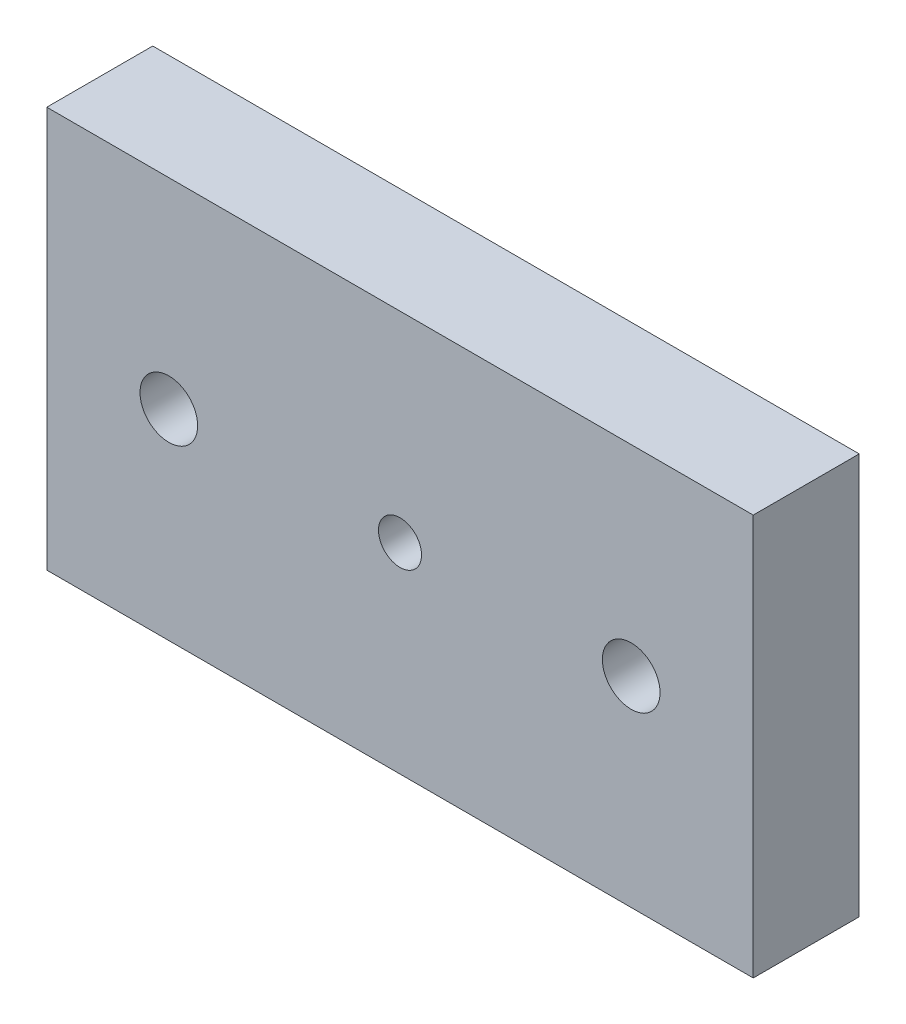
ISO-10303-21;
HEADER;
FILE_DESCRIPTION(('STEP AP214'),'2;1');
FILE_NAME('part.step','',(''),(''),'','','');
FILE_SCHEMA(('AUTOMOTIVE_DESIGN { 1 0 10303 214 1 1 1 1 }'));
ENDSEC;
DATA;
#1=APPLICATION_CONTEXT('core data for automotive mechanical design processes');
#2=APPLICATION_PROTOCOL_DEFINITION('international standard','automotive_design',2000,#1);
#3=PRODUCT_CONTEXT('',#1,'mechanical');
#4=PRODUCT('Part','Part','',(#3));
#5=PRODUCT_RELATED_PRODUCT_CATEGORY('part','',(#4));
#6=PRODUCT_DEFINITION_FORMATION('','',#4);
#7=PRODUCT_DEFINITION_CONTEXT('part definition',#1,'design');
#8=PRODUCT_DEFINITION('design','',#6,#7);
#9=PRODUCT_DEFINITION_SHAPE('','',#8);
#10=(LENGTH_UNIT() NAMED_UNIT(*) SI_UNIT(.MILLI.,.METRE.));
#11=(NAMED_UNIT(*) PLANE_ANGLE_UNIT() SI_UNIT($,.RADIAN.));
#12=(NAMED_UNIT(*) SI_UNIT($,.STERADIAN.) SOLID_ANGLE_UNIT());
#13=UNCERTAINTY_MEASURE_WITH_UNIT(LENGTH_MEASURE(1.E-05),#10,'distance_accuracy_value','');
#14=(GEOMETRIC_REPRESENTATION_CONTEXT(3) GLOBAL_UNCERTAINTY_ASSIGNED_CONTEXT((#13)) GLOBAL_UNIT_ASSIGNED_CONTEXT((#10,
#11,#12)) REPRESENTATION_CONTEXT('',''));
#15=CARTESIAN_POINT('',(0.,0.,0.));
#16=DIRECTION('',(0.,0.,1.));
#17=DIRECTION('',(1.,0.,0.));
#18=AXIS2_PLACEMENT_3D('',#15,#16,#17);
#19=CARTESIAN_POINT('',(20.,11.35,-6.));
#20=DIRECTION('',(1.,0.,0.));
#21=DIRECTION('',(0.,1.,0.));
#22=AXIS2_PLACEMENT_3D('',#19,#20,#21);
#23=PLANE('',#22);
#24=DIRECTION('',(0.,1.,0.));
#25=VECTOR('',#24,1.);
#26=CARTESIAN_POINT('',(20.,11.35,0.));
#27=LINE('',#26,#25);
#28=CARTESIAN_POINT('',(20.,-11.35,0.));
#29=VERTEX_POINT('',#28);
#30=CARTESIAN_POINT('',(20.,11.35,0.));
#31=VERTEX_POINT('',#30);
#32=EDGE_CURVE('E97',#29,#31,#27,.T.);
#33=ORIENTED_EDGE('',*,*,#32,.F.);
#34=DIRECTION('',(0.,0.,1.));
#35=VECTOR('',#34,1.);
#36=CARTESIAN_POINT('',(20.,-11.35,-6.));
#37=LINE('',#36,#35);
#38=CARTESIAN_POINT('',(20.,-11.35,-6.));
#39=VERTEX_POINT('',#38);
#40=EDGE_CURVE('E11',#39,#29,#37,.T.);
#41=ORIENTED_EDGE('',*,*,#40,.F.);
#42=DIRECTION('',(0.,1.,0.));
#43=VECTOR('',#42,1.);
#44=CARTESIAN_POINT('',(20.,11.35,-6.));
#45=LINE('',#44,#43);
#46=CARTESIAN_POINT('',(20.,11.35,-6.));
#47=VERTEX_POINT('',#46);
#48=EDGE_CURVE('E90',#39,#47,#45,.T.);
#49=ORIENTED_EDGE('',*,*,#48,.T.);
#50=DIRECTION('',(0.,0.,1.));
#51=VECTOR('',#50,1.);
#52=CARTESIAN_POINT('',(20.,11.35,-6.));
#53=LINE('',#52,#51);
#54=EDGE_CURVE('E35',#47,#31,#53,.T.);
#55=ORIENTED_EDGE('',*,*,#54,.T.);
#56=EDGE_LOOP('',(#33,#41,#49,#55));
#57=FACE_BOUND('',#56,.T.);
#58=ADVANCED_FACE('F32',(#57),#23,.T.);
#59=CARTESIAN_POINT('',(-20.,-11.35,-6.));
#60=DIRECTION('',(0.,-1.,0.));
#61=DIRECTION('',(0.,0.,-1.));
#62=AXIS2_PLACEMENT_3D('',#59,#60,#61);
#63=PLANE('',#62);
#64=DIRECTION('',(1.,0.,0.));
#65=VECTOR('',#64,1.);
#66=CARTESIAN_POINT('',(-20.,-11.35,0.));
#67=LINE('',#66,#65);
#68=CARTESIAN_POINT('',(-20.,-11.35,0.));
#69=VERTEX_POINT('',#68);
#70=EDGE_CURVE('E92',#69,#29,#67,.T.);
#71=ORIENTED_EDGE('',*,*,#70,.F.);
#72=DIRECTION('',(0.,0.,1.));
#73=VECTOR('',#72,1.);
#74=CARTESIAN_POINT('',(-20.,-11.35,-6.));
#75=LINE('',#74,#73);
#76=CARTESIAN_POINT('',(-20.,-11.35,-6.));
#77=VERTEX_POINT('',#76);
#78=EDGE_CURVE('E41',#77,#69,#75,.T.);
#79=ORIENTED_EDGE('',*,*,#78,.F.);
#80=DIRECTION('',(1.,0.,0.));
#81=VECTOR('',#80,1.);
#82=CARTESIAN_POINT('',(-20.,-11.35,-6.));
#83=LINE('',#82,#81);
#84=EDGE_CURVE('E87',#77,#39,#83,.T.);
#85=ORIENTED_EDGE('',*,*,#84,.T.);
#86=ORIENTED_EDGE('',*,*,#40,.T.);
#87=EDGE_LOOP('',(#71,#79,#85,#86));
#88=FACE_BOUND('',#87,.T.);
#89=ADVANCED_FACE('F108',(#88),#63,.T.);
#90=CARTESIAN_POINT('',(-20.,11.35,-6.));
#91=DIRECTION('',(-1.,0.,0.));
#92=DIRECTION('',(0.,-1.,0.));
#93=AXIS2_PLACEMENT_3D('',#90,#91,#92);
#94=PLANE('',#93);
#95=DIRECTION('',(0.,-1.,0.));
#96=VECTOR('',#95,1.);
#97=CARTESIAN_POINT('',(-20.,11.35,0.));
#98=LINE('',#97,#96);
#99=CARTESIAN_POINT('',(-20.,11.35,0.));
#100=VERTEX_POINT('',#99);
#101=EDGE_CURVE('E82',#100,#69,#98,.T.);
#102=ORIENTED_EDGE('',*,*,#101,.F.);
#103=DIRECTION('',(0.,0.,1.));
#104=VECTOR('',#103,1.);
#105=CARTESIAN_POINT('',(-20.,11.35,-6.));
#106=LINE('',#105,#104);
#107=CARTESIAN_POINT('',(-20.,11.35,-6.));
#108=VERTEX_POINT('',#107);
#109=EDGE_CURVE('E77',#108,#100,#106,.T.);
#110=ORIENTED_EDGE('',*,*,#109,.F.);
#111=DIRECTION('',(0.,-1.,0.));
#112=VECTOR('',#111,1.);
#113=CARTESIAN_POINT('',(-20.,11.35,-6.));
#114=LINE('',#113,#112);
#115=EDGE_CURVE('E80',#108,#77,#114,.T.);
#116=ORIENTED_EDGE('',*,*,#115,.T.);
#117=ORIENTED_EDGE('',*,*,#78,.T.);
#118=EDGE_LOOP('',(#102,#110,#116,#117));
#119=FACE_BOUND('',#118,.T.);
#120=ADVANCED_FACE('F79',(#119),#94,.T.);
#121=CARTESIAN_POINT('',(-20.,11.35,-6.));
#122=DIRECTION('',(0.,1.,0.));
#123=DIRECTION('',(0.,0.,1.));
#124=AXIS2_PLACEMENT_3D('',#121,#122,#123);
#125=PLANE('',#124);
#126=DIRECTION('',(-1.,0.,0.));
#127=VECTOR('',#126,1.);
#128=CARTESIAN_POINT('',(-20.,11.35,0.));
#129=LINE('',#128,#127);
#130=EDGE_CURVE('E100',#31,#100,#129,.T.);
#131=ORIENTED_EDGE('',*,*,#130,.F.);
#132=ORIENTED_EDGE('',*,*,#54,.F.);
#133=DIRECTION('',(-1.,0.,0.));
#134=VECTOR('',#133,1.);
#135=CARTESIAN_POINT('',(-20.,11.35,-6.));
#136=LINE('',#135,#134);
#137=EDGE_CURVE('E86',#47,#108,#136,.T.);
#138=ORIENTED_EDGE('',*,*,#137,.T.);
#139=ORIENTED_EDGE('',*,*,#109,.T.);
#140=EDGE_LOOP('',(#131,#132,#138,#139));
#141=FACE_BOUND('',#140,.T.);
#142=ADVANCED_FACE('F89',(#141),#125,.T.);
#143=CARTESIAN_POINT('',(0.,0.,-6.));
#144=DIRECTION('',(0.,0.,1.));
#145=DIRECTION('',(1.,0.,0.));
#146=AXIS2_PLACEMENT_3D('',#143,#144,#145);
#147=PLANE('',#146);
#148=CARTESIAN_POINT('',(0.,0.,-6.));
#149=DIRECTION('',(0.,0.,1.));
#150=DIRECTION('',(1.,0.,0.));
#151=AXIS2_PLACEMENT_3D('',#148,#149,#150);
#152=CIRCLE('',#151,1.2192);
#153=CARTESIAN_POINT('',(1.2192,0.,-6.));
#154=VERTEX_POINT('',#153);
#155=EDGE_CURVE('E145',#154,#154,#152,.T.);
#156=ORIENTED_EDGE('',*,*,#155,.T.);
#157=EDGE_LOOP('',(#156));
#158=FACE_BOUND('',#157,.T.);
#159=CARTESIAN_POINT('',(-13.09,0.,-6.));
#160=DIRECTION('',(0.,0.,1.));
#161=DIRECTION('',(1.,0.,0.));
#162=AXIS2_PLACEMENT_3D('',#159,#160,#161);
#163=CIRCLE('',#162,1.63195);
#164=CARTESIAN_POINT('',(-11.45805,0.,-6.));
#165=VERTEX_POINT('',#164);
#166=EDGE_CURVE('E155',#165,#165,#163,.T.);
#167=ORIENTED_EDGE('',*,*,#166,.T.);
#168=EDGE_LOOP('',(#167));
#169=FACE_BOUND('',#168,.T.);
#170=CARTESIAN_POINT('',(13.09,0.,-6.));
#171=DIRECTION('',(0.,0.,1.));
#172=DIRECTION('',(1.,0.,0.));
#173=AXIS2_PLACEMENT_3D('',#170,#171,#172);
#174=CIRCLE('',#173,1.63195);
#175=CARTESIAN_POINT('',(14.72195,0.,-6.));
#176=VERTEX_POINT('',#175);
#177=EDGE_CURVE('E101',#176,#176,#174,.T.);
#178=ORIENTED_EDGE('',*,*,#177,.T.);
#179=EDGE_LOOP('',(#178));
#180=FACE_BOUND('',#179,.T.);
#181=ORIENTED_EDGE('',*,*,#48,.F.);
#182=ORIENTED_EDGE('',*,*,#84,.F.);
#183=ORIENTED_EDGE('',*,*,#115,.F.);
#184=ORIENTED_EDGE('',*,*,#137,.F.);
#185=EDGE_LOOP('',(#181,#182,#183,#184));
#186=FACE_BOUND('',#185,.T.);
#187=ADVANCED_FACE('F85',(#158,#169,#180,#186),#147,.F.);
#188=CARTESIAN_POINT('',(0.,0.,0.));
#189=DIRECTION('',(0.,0.,1.));
#190=DIRECTION('',(1.,0.,0.));
#191=AXIS2_PLACEMENT_3D('',#188,#189,#190);
#192=PLANE('',#191);
#193=CARTESIAN_POINT('',(0.,0.,0.));
#194=DIRECTION('',(0.,0.,1.));
#195=DIRECTION('',(1.,0.,0.));
#196=AXIS2_PLACEMENT_3D('',#193,#194,#195);
#197=CIRCLE('',#196,1.2192);
#198=CARTESIAN_POINT('',(1.2192,0.,0.));
#199=VERTEX_POINT('',#198);
#200=EDGE_CURVE('E148',#199,#199,#197,.T.);
#201=ORIENTED_EDGE('',*,*,#200,.F.);
#202=EDGE_LOOP('',(#201));
#203=FACE_BOUND('',#202,.T.);
#204=CARTESIAN_POINT('',(-13.09,0.,0.));
#205=DIRECTION('',(0.,0.,1.));
#206=DIRECTION('',(1.,0.,0.));
#207=AXIS2_PLACEMENT_3D('',#204,#205,#206);
#208=CIRCLE('',#207,1.63194999999999);
#209=CARTESIAN_POINT('',(-11.45805,0.,0.));
#210=VERTEX_POINT('',#209);
#211=EDGE_CURVE('E150',#210,#210,#208,.T.);
#212=ORIENTED_EDGE('',*,*,#211,.F.);
#213=EDGE_LOOP('',(#212));
#214=FACE_BOUND('',#213,.T.);
#215=CARTESIAN_POINT('',(13.09,0.,0.));
#216=DIRECTION('',(0.,0.,1.));
#217=DIRECTION('',(1.,0.,0.));
#218=AXIS2_PLACEMENT_3D('',#215,#216,#217);
#219=CIRCLE('',#218,1.63194999999999);
#220=CARTESIAN_POINT('',(14.72195,0.,0.));
#221=VERTEX_POINT('',#220);
#222=EDGE_CURVE('E158',#221,#221,#219,.T.);
#223=ORIENTED_EDGE('',*,*,#222,.F.);
#224=EDGE_LOOP('',(#223));
#225=FACE_BOUND('',#224,.T.);
#226=ORIENTED_EDGE('',*,*,#32,.T.);
#227=ORIENTED_EDGE('',*,*,#130,.T.);
#228=ORIENTED_EDGE('',*,*,#101,.T.);
#229=ORIENTED_EDGE('',*,*,#70,.T.);
#230=EDGE_LOOP('',(#226,#227,#228,#229));
#231=FACE_BOUND('',#230,.T.);
#232=ADVANCED_FACE('F107',(#203,#214,#225,#231),#192,.T.);
#233=CARTESIAN_POINT('',(13.09,0.,0.));
#234=DIRECTION('',(0.,0.,1.));
#235=DIRECTION('',(1.,0.,0.));
#236=AXIS2_PLACEMENT_3D('',#233,#234,#235);
#237=CYLINDRICAL_SURFACE('',#236,1.63194999999999);
#238=ORIENTED_EDGE('',*,*,#177,.F.);
#239=EDGE_LOOP('',(#238));
#240=FACE_BOUND('',#239,.T.);
#241=ORIENTED_EDGE('',*,*,#222,.T.);
#242=EDGE_LOOP('',(#241));
#243=FACE_BOUND('',#242,.T.);
#244=ADVANCED_FACE('F126',(#240,#243),#237,.F.);
#245=CARTESIAN_POINT('',(-13.09,0.,0.));
#246=DIRECTION('',(0.,0.,1.));
#247=DIRECTION('',(1.,0.,0.));
#248=AXIS2_PLACEMENT_3D('',#245,#246,#247);
#249=CYLINDRICAL_SURFACE('',#248,1.63194999999999);
#250=ORIENTED_EDGE('',*,*,#166,.F.);
#251=EDGE_LOOP('',(#250));
#252=FACE_BOUND('',#251,.T.);
#253=ORIENTED_EDGE('',*,*,#211,.T.);
#254=EDGE_LOOP('',(#253));
#255=FACE_BOUND('',#254,.T.);
#256=ADVANCED_FACE('F133',(#252,#255),#249,.F.);
#257=CARTESIAN_POINT('',(0.,0.,0.));
#258=DIRECTION('',(0.,0.,1.));
#259=DIRECTION('',(1.,0.,0.));
#260=AXIS2_PLACEMENT_3D('',#257,#258,#259);
#261=CYLINDRICAL_SURFACE('',#260,1.2192);
#262=ORIENTED_EDGE('',*,*,#155,.F.);
#263=EDGE_LOOP('',(#262));
#264=FACE_BOUND('',#263,.T.);
#265=ORIENTED_EDGE('',*,*,#200,.T.);
#266=EDGE_LOOP('',(#265));
#267=FACE_BOUND('',#266,.T.);
#268=ADVANCED_FACE('F137',(#264,#267),#261,.F.);
#269=CLOSED_SHELL('',(#58,#89,#120,#142,#187,#232,#244,#256,#268));
#270=MANIFOLD_SOLID_BREP('B2',#269);
#271=ADVANCED_BREP_SHAPE_REPRESENTATION('',(#18,#270),#14);
#272=SHAPE_DEFINITION_REPRESENTATION(#9,#271);
ENDSEC;
END-ISO-10303-21;
